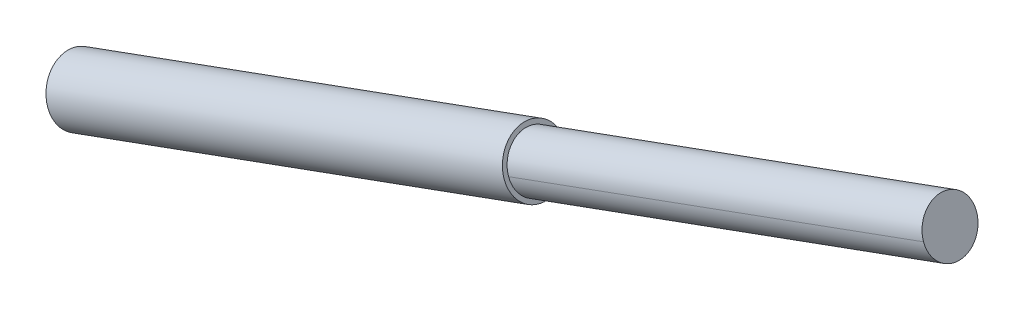
ISO-10303-21;
HEADER;
FILE_DESCRIPTION(('STEP AP214'),'2;1');
FILE_NAME('part.step','',(''),(''),'','','');
FILE_SCHEMA(('AUTOMOTIVE_DESIGN { 1 0 10303 214 1 1 1 1 }'));
ENDSEC;
DATA;
#1=APPLICATION_CONTEXT('core data for automotive mechanical design processes');
#2=APPLICATION_PROTOCOL_DEFINITION('international standard','automotive_design',2000,#1);
#3=PRODUCT_CONTEXT('',#1,'mechanical');
#4=PRODUCT('Part','Part','',(#3));
#5=PRODUCT_RELATED_PRODUCT_CATEGORY('part','',(#4));
#6=PRODUCT_DEFINITION_FORMATION('','',#4);
#7=PRODUCT_DEFINITION_CONTEXT('part definition',#1,'design');
#8=PRODUCT_DEFINITION('design','',#6,#7);
#9=PRODUCT_DEFINITION_SHAPE('','',#8);
#10=(LENGTH_UNIT() NAMED_UNIT(*) SI_UNIT(.MILLI.,.METRE.));
#11=(NAMED_UNIT(*) PLANE_ANGLE_UNIT() SI_UNIT($,.RADIAN.));
#12=(NAMED_UNIT(*) SI_UNIT($,.STERADIAN.) SOLID_ANGLE_UNIT());
#13=UNCERTAINTY_MEASURE_WITH_UNIT(LENGTH_MEASURE(1.E-05),#10,'distance_accuracy_value','');
#14=(GEOMETRIC_REPRESENTATION_CONTEXT(3) GLOBAL_UNCERTAINTY_ASSIGNED_CONTEXT((#13)) GLOBAL_UNIT_ASSIGNED_CONTEXT((#10,
#11,#12)) REPRESENTATION_CONTEXT('',''));
#15=CARTESIAN_POINT('',(0.,0.,0.));
#16=DIRECTION('',(0.,0.,1.));
#17=DIRECTION('',(1.,0.,0.));
#18=AXIS2_PLACEMENT_3D('',#15,#16,#17);
#19=CARTESIAN_POINT('',(-201.92652613956,-61.9617588500008,336.59864258433));
#20=DIRECTION('',(0.93969262078591,0.342020143325663,0.));
#21=DIRECTION('',(0.342020143325663,-0.93969262078591,0.));
#22=AXIS2_PLACEMENT_3D('',#19,#20,#21);
#23=PLANE('',#22);
#24=CARTESIAN_POINT('',(-190.810871481476,-92.5017690255429,406.59864258433));
#25=DIRECTION('',(0.93969262078591,0.342020143325663,0.));
#26=DIRECTION('',(0.,0.,-1.));
#27=AXIS2_PLACEMENT_3D('',#24,#25,#26);
#28=CIRCLE('',#27,15.);
#29=CARTESIAN_POINT('',(-190.810871481476,-92.5017690255429,421.59864258433));
#30=VERTEX_POINT('',#29);
#31=CARTESIAN_POINT('',(-190.810871481476,-92.5017690255429,391.59864258433));
#32=VERTEX_POINT('',#31);
#33=EDGE_CURVE('E121',#30,#32,#28,.T.);
#34=ORIENTED_EDGE('',*,*,#33,.F.);
#35=CARTESIAN_POINT('',(-190.810871481476,-92.5017690255429,406.59864258433));
#36=DIRECTION('',(0.93969262078591,0.342020143325663,0.));
#37=DIRECTION('',(0.,0.,-1.));
#38=AXIS2_PLACEMENT_3D('',#35,#36,#37);
#39=CIRCLE('',#38,15.);
#40=EDGE_CURVE('E58',#32,#30,#39,.T.);
#41=ORIENTED_EDGE('',*,*,#40,.F.);
#42=EDGE_LOOP('',(#34,#41));
#43=FACE_BOUND('',#42,.T.);
#44=CARTESIAN_POINT('',(-190.810871481476,-92.5017690255429,406.59864258433));
#45=DIRECTION('',(0.93969262078591,0.342020143325663,0.));
#46=DIRECTION('',(-0.342020143325663,0.93969262078591,0.));
#47=AXIS2_PLACEMENT_3D('',#44,#45,#46);
#48=CIRCLE('',#47,17.4999999999999);
#49=CARTESIAN_POINT('',(-196.796223989675,-76.0571481617895,406.59864258433));
#50=VERTEX_POINT('',#49);
#51=EDGE_CURVE('E132',#50,#50,#48,.T.);
#52=ORIENTED_EDGE('',*,*,#51,.T.);
#53=EDGE_LOOP('',(#52));
#54=FACE_BOUND('',#53,.T.);
#55=ADVANCED_FACE('F48',(#43,#54),#23,.T.);
#56=CARTESIAN_POINT('',(44.1122837150014,-6.99673319412705,406.59864258433));
#57=DIRECTION('',(-0.93969262078591,-0.342020143325663,0.));
#58=DIRECTION('',(0.,0.,1.));
#59=AXIS2_PLACEMENT_3D('',#56,#57,#58);
#60=CYLINDRICAL_SURFACE('',#59,15.);
#61=CARTESIAN_POINT('',(44.1122837150014,-6.99673319412705,406.59864258433));
#62=DIRECTION('',(0.93969262078591,0.342020143325663,0.));
#63=DIRECTION('',(0.,0.,-1.));
#64=AXIS2_PLACEMENT_3D('',#61,#62,#63);
#65=CIRCLE('',#64,15.);
#66=CARTESIAN_POINT('',(44.1122837150014,-6.99673319412705,391.59864258433));
#67=VERTEX_POINT('',#66);
#68=CARTESIAN_POINT('',(44.1122837150014,-6.99673319412705,421.59864258433));
#69=VERTEX_POINT('',#68);
#70=EDGE_CURVE('E52',#67,#69,#65,.T.);
#71=ORIENTED_EDGE('',*,*,#70,.F.);
#72=DIRECTION('',(-0.93969262078591,-0.342020143325663,0.));
#73=VECTOR('',#72,1.);
#74=CARTESIAN_POINT('',(44.1122837150014,-6.99673319412705,391.59864258433));
#75=LINE('',#74,#73);
#76=EDGE_CURVE('E11',#67,#32,#75,.T.);
#77=ORIENTED_EDGE('',*,*,#76,.T.);
#78=ORIENTED_EDGE('',*,*,#40,.T.);
#79=DIRECTION('',(-0.93969262078591,-0.342020143325663,0.));
#80=VECTOR('',#79,1.);
#81=CARTESIAN_POINT('',(44.1122837150014,-6.99673319412705,421.59864258433));
#82=LINE('',#81,#80);
#83=EDGE_CURVE('E109',#69,#30,#82,.T.);
#84=ORIENTED_EDGE('',*,*,#83,.F.);
#85=EDGE_LOOP('',(#71,#77,#78,#84));
#86=FACE_BOUND('',#85,.T.);
#87=ADVANCED_FACE('F141',(#86),#60,.T.);
#88=CARTESIAN_POINT('',(44.1122837150014,-6.99673319412705,406.59864258433));
#89=DIRECTION('',(-0.93969262078591,-0.342020143325663,0.));
#90=DIRECTION('',(0.,0.,1.));
#91=AXIS2_PLACEMENT_3D('',#88,#89,#90);
#92=CYLINDRICAL_SURFACE('',#91,15.);
#93=ORIENTED_EDGE('',*,*,#76,.F.);
#94=CARTESIAN_POINT('',(44.1122837150014,-6.99673319412705,406.59864258433));
#95=DIRECTION('',(0.93969262078591,0.342020143325663,0.));
#96=DIRECTION('',(0.,0.,-1.));
#97=AXIS2_PLACEMENT_3D('',#94,#95,#96);
#98=CIRCLE('',#97,15.);
#99=EDGE_CURVE('E125',#69,#67,#98,.T.);
#100=ORIENTED_EDGE('',*,*,#99,.F.);
#101=ORIENTED_EDGE('',*,*,#83,.T.);
#102=ORIENTED_EDGE('',*,*,#33,.T.);
#103=EDGE_LOOP('',(#93,#100,#101,#102));
#104=FACE_BOUND('',#103,.T.);
#105=ADVANCED_FACE('F143',(#104),#92,.T.);
#106=CARTESIAN_POINT('',(44.1122837150014,-6.99673319412705,406.59864258433));
#107=DIRECTION('',(0.93969262078591,0.342020143325663,0.));
#108=DIRECTION('',(0.342020143325663,-0.93969262078591,0.));
#109=AXIS2_PLACEMENT_3D('',#106,#107,#108);
#110=PLANE('',#109);
#111=ORIENTED_EDGE('',*,*,#99,.T.);
#112=ORIENTED_EDGE('',*,*,#70,.T.);
#113=EDGE_LOOP('',(#111,#112));
#114=FACE_BOUND('',#113,.T.);
#115=ADVANCED_FACE('F139',(#114),#110,.T.);
#116=CARTESIAN_POINT('',(-449.226342197602,-186.5573084401,406.59864258433));
#117=DIRECTION('',(-0.93969262078591,-0.342020143325663,0.));
#118=DIRECTION('',(0.,0.,1.));
#119=AXIS2_PLACEMENT_3D('',#116,#117,#118);
#120=PLANE('',#119);
#121=CARTESIAN_POINT('',(-449.226342197602,-186.5573084401,406.59864258433));
#122=DIRECTION('',(-0.93969262078591,-0.342020143325663,0.));
#123=DIRECTION('',(0.,0.,1.));
#124=AXIS2_PLACEMENT_3D('',#121,#122,#123);
#125=CIRCLE('',#124,17.5);
#126=CARTESIAN_POINT('',(-449.226342197602,-186.5573084401,389.09864258433));
#127=VERTEX_POINT('',#126);
#128=CARTESIAN_POINT('',(-449.226342197602,-186.5573084401,424.09864258433));
#129=VERTEX_POINT('',#128);
#130=EDGE_CURVE('E108',#127,#129,#125,.T.);
#131=ORIENTED_EDGE('',*,*,#130,.T.);
#132=CARTESIAN_POINT('',(-449.226342197602,-186.5573084401,406.59864258433));
#133=DIRECTION('',(-0.93969262078591,-0.342020143325663,0.));
#134=DIRECTION('',(0.,0.,1.));
#135=AXIS2_PLACEMENT_3D('',#132,#133,#134);
#136=CIRCLE('',#135,17.5);
#137=EDGE_CURVE('E101',#129,#127,#136,.T.);
#138=ORIENTED_EDGE('',*,*,#137,.T.);
#139=EDGE_LOOP('',(#131,#138));
#140=FACE_BOUND('',#139,.T.);
#141=ADVANCED_FACE('F113',(#140),#120,.T.);
#142=CARTESIAN_POINT('',(-449.226342197602,-186.5573084401,406.59864258433));
#143=DIRECTION('',(0.93969262078591,0.342020143325663,0.));
#144=DIRECTION('',(0.,0.,-1.));
#145=AXIS2_PLACEMENT_3D('',#142,#143,#144);
#146=CYLINDRICAL_SURFACE('',#145,17.5);
#147=ORIENTED_EDGE('',*,*,#137,.F.);
#148=DIRECTION('',(0.93969262078591,0.342020143325663,0.));
#149=VECTOR('',#148,1.);
#150=CARTESIAN_POINT('',(-449.226342197602,-186.5573084401,424.09864258433));
#151=LINE('',#150,#149);
#152=CARTESIAN_POINT('',(-341.161690807222,-147.224991957649,424.09864258433));
#153=VERTEX_POINT('',#152);
#154=EDGE_CURVE('E104',#129,#153,#151,.T.);
#155=ORIENTED_EDGE('',*,*,#154,.T.);
#156=ORIENTED_EDGE('',*,*,#154,.F.);
#157=ORIENTED_EDGE('',*,*,#130,.F.);
#158=DIRECTION('',(0.93969262078591,0.342020143325663,0.));
#159=VECTOR('',#158,1.);
#160=CARTESIAN_POINT('',(-449.226342197602,-186.5573084401,389.09864258433));
#161=LINE('',#160,#159);
#162=CARTESIAN_POINT('',(-341.161690807222,-147.224991957649,389.09864258433));
#163=VERTEX_POINT('',#162);
#164=EDGE_CURVE('E97',#127,#163,#161,.T.);
#165=ORIENTED_EDGE('',*,*,#164,.T.);
#166=ORIENTED_EDGE('',*,*,#164,.F.);
#167=EDGE_LOOP('',(#147,#155,#156,#157,#165,#166));
#168=FACE_BOUND('',#167,.T.);
#169=ORIENTED_EDGE('',*,*,#51,.F.);
#170=EDGE_LOOP('',(#169));
#171=FACE_BOUND('',#170,.T.);
#172=ADVANCED_FACE('F50',(#168,#171),#146,.T.);
#173=CLOSED_SHELL('',(#55,#87,#105,#115,#141,#172));
#174=MANIFOLD_SOLID_BREP('B2',#173);
#175=ADVANCED_BREP_SHAPE_REPRESENTATION('',(#18,#174),#14);
#176=SHAPE_DEFINITION_REPRESENTATION(#9,#175);
ENDSEC;
END-ISO-10303-21;
